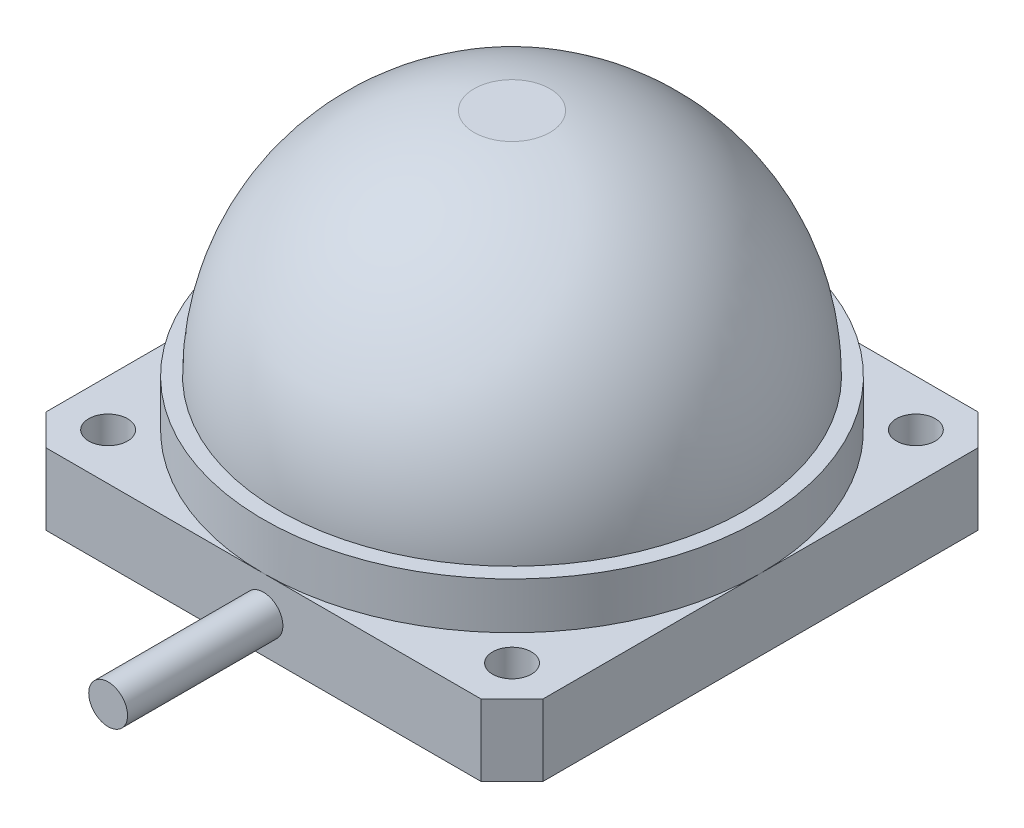
ISO-10303-21;
HEADER;
FILE_DESCRIPTION(('STEP AP214'),'2;1');
FILE_NAME('part.step','',(''),(''),'','','');
FILE_SCHEMA(('AUTOMOTIVE_DESIGN { 1 0 10303 214 1 1 1 1 }'));
ENDSEC;
DATA;
#1=APPLICATION_CONTEXT('core data for automotive mechanical design processes');
#2=APPLICATION_PROTOCOL_DEFINITION('international standard','automotive_design',2000,#1);
#3=PRODUCT_CONTEXT('',#1,'mechanical');
#4=PRODUCT('Part','Part','',(#3));
#5=PRODUCT_RELATED_PRODUCT_CATEGORY('part','',(#4));
#6=PRODUCT_DEFINITION_FORMATION('','',#4);
#7=PRODUCT_DEFINITION_CONTEXT('part definition',#1,'design');
#8=PRODUCT_DEFINITION('design','',#6,#7);
#9=PRODUCT_DEFINITION_SHAPE('','',#8);
#10=(LENGTH_UNIT() NAMED_UNIT(*) SI_UNIT(.MILLI.,.METRE.));
#11=(NAMED_UNIT(*) PLANE_ANGLE_UNIT() SI_UNIT($,.RADIAN.));
#12=(NAMED_UNIT(*) SI_UNIT($,.STERADIAN.) SOLID_ANGLE_UNIT());
#13=UNCERTAINTY_MEASURE_WITH_UNIT(LENGTH_MEASURE(1.E-05),#10,'distance_accuracy_value','');
#14=(GEOMETRIC_REPRESENTATION_CONTEXT(3) GLOBAL_UNCERTAINTY_ASSIGNED_CONTEXT((#13)) GLOBAL_UNIT_ASSIGNED_CONTEXT((#10,
#11,#12)) REPRESENTATION_CONTEXT('',''));
#15=CARTESIAN_POINT('',(0.,0.,0.));
#16=DIRECTION('',(0.,0.,1.));
#17=DIRECTION('',(1.,0.,0.));
#18=AXIS2_PLACEMENT_3D('',#15,#16,#17);
#19=CARTESIAN_POINT('',(0.,0.,0.));
#20=DIRECTION('',(0.,1.,0.));
#21=DIRECTION('',(1.,0.,0.));
#22=AXIS2_PLACEMENT_3D('',#19,#20,#21);
#23=SPHERICAL_SURFACE('',#22,15.);
#24=CARTESIAN_POINT('',(0.,0.,0.));
#25=DIRECTION('',(0.,-1.,0.));
#26=DIRECTION('',(1.,0.,0.));
#27=AXIS2_PLACEMENT_3D('',#24,#25,#26);
#28=CIRCLE('',#27,15.);
#29=CARTESIAN_POINT('',(15.,0.,0.));
#30=VERTEX_POINT('',#29);
#31=EDGE_CURVE('E148',#30,#30,#28,.T.);
#32=ORIENTED_EDGE('',*,*,#31,.F.);
#33=EDGE_LOOP('',(#32));
#34=FACE_BOUND('',#33,.T.);
#35=CARTESIAN_POINT('',(0.,14.8,0.));
#36=DIRECTION('',(0.,1.,0.));
#37=DIRECTION('',(0.,0.,1.));
#38=AXIS2_PLACEMENT_3D('',#35,#36,#37);
#39=CIRCLE('',#38,2.44131112314675);
#40=CARTESIAN_POINT('',(0.,14.8,2.44131112314675));
#41=VERTEX_POINT('',#40);
#42=EDGE_CURVE('E46',#41,#41,#39,.T.);
#43=ORIENTED_EDGE('',*,*,#42,.F.);
#44=EDGE_LOOP('',(#43));
#45=FACE_BOUND('',#44,.T.);
#46=ADVANCED_FACE('F41',(#34,#45),#23,.T.);
#47=CARTESIAN_POINT('',(0.,-3.,0.));
#48=DIRECTION('',(0.,1.,0.));
#49=DIRECTION('',(-1.,0.,0.));
#50=AXIS2_PLACEMENT_3D('',#47,#48,#49);
#51=CYLINDRICAL_SURFACE('',#50,16.);
#52=CARTESIAN_POINT('',(0.,-3.,0.));
#53=DIRECTION('',(0.,-1.,0.));
#54=DIRECTION('',(1.,0.,0.));
#55=AXIS2_PLACEMENT_3D('',#52,#53,#54);
#56=CIRCLE('',#55,16.);
#57=CARTESIAN_POINT('',(16.,-3.,0.));
#58=VERTEX_POINT('',#57);
#59=CARTESIAN_POINT('',(0.,-3.,16.));
#60=VERTEX_POINT('',#59);
#61=EDGE_CURVE('E138',#58,#60,#56,.T.);
#62=ORIENTED_EDGE('',*,*,#61,.F.);
#63=CARTESIAN_POINT('',(0.,-3.,-16.));
#64=VERTEX_POINT('',#63);
#65=EDGE_CURVE('E142',#64,#58,#56,.T.);
#66=ORIENTED_EDGE('',*,*,#65,.F.);
#67=CARTESIAN_POINT('',(-16.,-3.,0.));
#68=VERTEX_POINT('',#67);
#69=EDGE_CURVE('E154',#68,#64,#56,.T.);
#70=ORIENTED_EDGE('',*,*,#69,.F.);
#71=EDGE_CURVE('E145',#60,#68,#56,.T.);
#72=ORIENTED_EDGE('',*,*,#71,.F.);
#73=EDGE_LOOP('',(#62,#66,#70,#72));
#74=FACE_BOUND('',#73,.T.);
#75=CARTESIAN_POINT('',(0.,0.,0.));
#76=DIRECTION('',(0.,-1.,0.));
#77=DIRECTION('',(1.,0.,0.));
#78=AXIS2_PLACEMENT_3D('',#75,#76,#77);
#79=CIRCLE('',#78,16.);
#80=CARTESIAN_POINT('',(16.,0.,0.));
#81=VERTEX_POINT('',#80);
#82=EDGE_CURVE('E155',#81,#81,#79,.T.);
#83=ORIENTED_EDGE('',*,*,#82,.T.);
#84=EDGE_LOOP('',(#83));
#85=FACE_BOUND('',#84,.T.);
#86=ADVANCED_FACE('F139',(#74,#85),#51,.T.);
#87=CARTESIAN_POINT('',(0.,0.,0.));
#88=DIRECTION('',(0.,-1.,0.));
#89=DIRECTION('',(1.,0.,0.));
#90=AXIS2_PLACEMENT_3D('',#87,#88,#89);
#91=PLANE('',#90);
#92=ORIENTED_EDGE('',*,*,#31,.T.);
#93=EDGE_LOOP('',(#92));
#94=FACE_BOUND('',#93,.T.);
#95=ORIENTED_EDGE('',*,*,#82,.F.);
#96=EDGE_LOOP('',(#95));
#97=FACE_BOUND('',#96,.T.);
#98=ADVANCED_FACE('F283',(#94,#97),#91,.F.);
#99=CARTESIAN_POINT('',(0.,-3.,0.));
#100=DIRECTION('',(0.,1.,0.));
#101=DIRECTION('',(-1.,0.,0.));
#102=AXIS2_PLACEMENT_3D('',#99,#100,#101);
#103=PLANE('',#102);
#104=CARTESIAN_POINT('',(13.,-3.,13.));
#105=DIRECTION('',(0.,1.,0.));
#106=DIRECTION('',(0.,0.,1.));
#107=AXIS2_PLACEMENT_3D('',#104,#105,#106);
#108=CIRCLE('',#107,1.25);
#109=CARTESIAN_POINT('',(13.,-3.,14.25));
#110=VERTEX_POINT('',#109);
#111=EDGE_CURVE('E257',#110,#110,#108,.T.);
#112=ORIENTED_EDGE('',*,*,#111,.F.);
#113=EDGE_LOOP('',(#112));
#114=FACE_BOUND('',#113,.T.);
#115=DIRECTION('',(-1.,0.,0.));
#116=VECTOR('',#115,1.);
#117=CARTESIAN_POINT('',(-16.,-3.,16.));
#118=LINE('',#117,#116);
#119=CARTESIAN_POINT('',(14.,-3.,16.));
#120=VERTEX_POINT('',#119);
#121=EDGE_CURVE('E165',#120,#60,#118,.T.);
#122=ORIENTED_EDGE('',*,*,#121,.F.);
#123=DIRECTION('',(-0.707106781186546,0.,0.707106781186549));
#124=VECTOR('',#123,1.);
#125=CARTESIAN_POINT('',(15.,-3.,15.));
#126=LINE('',#125,#124);
#127=CARTESIAN_POINT('',(16.,-3.,14.));
#128=VERTEX_POINT('',#127);
#129=EDGE_CURVE('E51',#120,#128,#126,.F.);
#130=ORIENTED_EDGE('',*,*,#129,.T.);
#131=DIRECTION('',(0.,0.,1.));
#132=VECTOR('',#131,1.);
#133=CARTESIAN_POINT('',(16.,-3.,-16.));
#134=LINE('',#133,#132);
#135=EDGE_CURVE('E127',#58,#128,#134,.T.);
#136=ORIENTED_EDGE('',*,*,#135,.F.);
#137=ORIENTED_EDGE('',*,*,#61,.T.);
#138=EDGE_LOOP('',(#122,#130,#136,#137));
#139=FACE_BOUND('',#138,.T.);
#140=ADVANCED_FACE('F156',(#114,#139),#103,.T.);
#141=CARTESIAN_POINT('',(-13.,-3.,13.));
#142=DIRECTION('',(0.,1.,0.));
#143=DIRECTION('',(0.,0.,1.));
#144=AXIS2_PLACEMENT_3D('',#141,#142,#143);
#145=CIRCLE('',#144,1.25);
#146=CARTESIAN_POINT('',(-13.,-3.,14.25));
#147=VERTEX_POINT('',#146);
#148=EDGE_CURVE('E159',#147,#147,#145,.T.);
#149=ORIENTED_EDGE('',*,*,#148,.F.);
#150=EDGE_LOOP('',(#149));
#151=FACE_BOUND('',#150,.T.);
#152=DIRECTION('',(0.,0.,-1.));
#153=VECTOR('',#152,1.);
#154=CARTESIAN_POINT('',(-16.,-3.,-16.));
#155=LINE('',#154,#153);
#156=CARTESIAN_POINT('',(-16.,-3.,14.));
#157=VERTEX_POINT('',#156);
#158=EDGE_CURVE('E168',#157,#68,#155,.T.);
#159=ORIENTED_EDGE('',*,*,#158,.F.);
#160=DIRECTION('',(-0.707106781186549,0.,-0.707106781186546));
#161=VECTOR('',#160,1.);
#162=CARTESIAN_POINT('',(-15.,-3.,15.));
#163=LINE('',#162,#161);
#164=CARTESIAN_POINT('',(-14.,-3.,16.));
#165=VERTEX_POINT('',#164);
#166=EDGE_CURVE('E65',#157,#165,#163,.F.);
#167=ORIENTED_EDGE('',*,*,#166,.T.);
#168=EDGE_CURVE('E132',#60,#165,#118,.T.);
#169=ORIENTED_EDGE('',*,*,#168,.F.);
#170=ORIENTED_EDGE('',*,*,#71,.T.);
#171=EDGE_LOOP('',(#159,#167,#169,#170));
#172=FACE_BOUND('',#171,.T.);
#173=ADVANCED_FACE('F228',(#151,#172),#103,.T.);
#174=CARTESIAN_POINT('',(-13.,-3.,-13.));
#175=DIRECTION('',(0.,1.,0.));
#176=DIRECTION('',(0.,0.,1.));
#177=AXIS2_PLACEMENT_3D('',#174,#175,#176);
#178=CIRCLE('',#177,1.25);
#179=CARTESIAN_POINT('',(-13.,-3.,-11.75));
#180=VERTEX_POINT('',#179);
#181=EDGE_CURVE('E263',#180,#180,#178,.T.);
#182=ORIENTED_EDGE('',*,*,#181,.F.);
#183=EDGE_LOOP('',(#182));
#184=FACE_BOUND('',#183,.T.);
#185=DIRECTION('',(1.,0.,0.));
#186=VECTOR('',#185,1.);
#187=CARTESIAN_POINT('',(-16.,-3.,-16.));
#188=LINE('',#187,#186);
#189=CARTESIAN_POINT('',(-14.,-3.,-16.));
#190=VERTEX_POINT('',#189);
#191=EDGE_CURVE('E170',#190,#64,#188,.T.);
#192=ORIENTED_EDGE('',*,*,#191,.F.);
#193=DIRECTION('',(0.707106781186546,0.,-0.707106781186549));
#194=VECTOR('',#193,1.);
#195=CARTESIAN_POINT('',(-15.,-3.,-15.));
#196=LINE('',#195,#194);
#197=CARTESIAN_POINT('',(-16.,-3.,-14.));
#198=VERTEX_POINT('',#197);
#199=EDGE_CURVE('E182',#190,#198,#196,.F.);
#200=ORIENTED_EDGE('',*,*,#199,.T.);
#201=EDGE_CURVE('E167',#68,#198,#155,.T.);
#202=ORIENTED_EDGE('',*,*,#201,.F.);
#203=ORIENTED_EDGE('',*,*,#69,.T.);
#204=EDGE_LOOP('',(#192,#200,#202,#203));
#205=FACE_BOUND('',#204,.T.);
#206=ADVANCED_FACE('F232',(#184,#205),#103,.T.);
#207=CARTESIAN_POINT('',(16.,-7.6,-16.));
#208=DIRECTION('',(-1.,0.,0.));
#209=DIRECTION('',(0.,-1.,0.));
#210=AXIS2_PLACEMENT_3D('',#207,#208,#209);
#211=PLANE('',#210);
#212=DIRECTION('',(0.,0.,1.));
#213=VECTOR('',#212,1.);
#214=CARTESIAN_POINT('',(16.,-7.6,-16.));
#215=LINE('',#214,#213);
#216=CARTESIAN_POINT('',(16.,-7.6,-14.));
#217=VERTEX_POINT('',#216);
#218=CARTESIAN_POINT('',(16.,-7.6,14.));
#219=VERTEX_POINT('',#218);
#220=EDGE_CURVE('E171',#217,#219,#215,.T.);
#221=ORIENTED_EDGE('',*,*,#220,.F.);
#222=DIRECTION('',(0.,1.,0.));
#223=VECTOR('',#222,1.);
#224=CARTESIAN_POINT('',(16.,-7.6,-14.));
#225=LINE('',#224,#223);
#226=CARTESIAN_POINT('',(16.,-3.,-14.));
#227=VERTEX_POINT('',#226);
#228=EDGE_CURVE('E129',#217,#227,#225,.T.);
#229=ORIENTED_EDGE('',*,*,#228,.T.);
#230=EDGE_CURVE('E122',#227,#58,#134,.T.);
#231=ORIENTED_EDGE('',*,*,#230,.T.);
#232=ORIENTED_EDGE('',*,*,#135,.T.);
#233=DIRECTION('',(0.,-1.,0.));
#234=VECTOR('',#233,1.);
#235=CARTESIAN_POINT('',(16.,-7.6,14.));
#236=LINE('',#235,#234);
#237=EDGE_CURVE('E197',#128,#219,#236,.T.);
#238=ORIENTED_EDGE('',*,*,#237,.T.);
#239=EDGE_LOOP('',(#221,#229,#231,#232,#238));
#240=FACE_BOUND('',#239,.T.);
#241=ADVANCED_FACE('F125',(#240),#211,.F.);
#242=CARTESIAN_POINT('',(-16.,-7.6,16.));
#243=DIRECTION('',(0.,0.,-1.));
#244=DIRECTION('',(-1.,0.,0.));
#245=AXIS2_PLACEMENT_3D('',#242,#243,#244);
#246=PLANE('',#245);
#247=CARTESIAN_POINT('',(0.,-5.3,16.));
#248=DIRECTION('',(0.,0.,-1.));
#249=DIRECTION('',(-1.,0.,0.));
#250=AXIS2_PLACEMENT_3D('',#247,#248,#249);
#251=CIRCLE('',#250,1.25);
#252=CARTESIAN_POINT('',(-1.25,-5.3,16.));
#253=VERTEX_POINT('',#252);
#254=EDGE_CURVE('E11',#253,#253,#251,.F.);
#255=ORIENTED_EDGE('',*,*,#254,.F.);
#256=EDGE_LOOP('',(#255));
#257=FACE_BOUND('',#256,.T.);
#258=ORIENTED_EDGE('',*,*,#168,.T.);
#259=DIRECTION('',(0.,-1.,0.));
#260=VECTOR('',#259,1.);
#261=CARTESIAN_POINT('',(-14.,-7.6,16.));
#262=LINE('',#261,#260);
#263=CARTESIAN_POINT('',(-14.,-7.6,16.));
#264=VERTEX_POINT('',#263);
#265=EDGE_CURVE('E205',#165,#264,#262,.T.);
#266=ORIENTED_EDGE('',*,*,#265,.T.);
#267=DIRECTION('',(-1.,0.,0.));
#268=VECTOR('',#267,1.);
#269=CARTESIAN_POINT('',(-16.,-7.6,16.));
#270=LINE('',#269,#268);
#271=CARTESIAN_POINT('',(14.,-7.6,16.));
#272=VERTEX_POINT('',#271);
#273=EDGE_CURVE('E212',#272,#264,#270,.T.);
#274=ORIENTED_EDGE('',*,*,#273,.F.);
#275=DIRECTION('',(0.,1.,0.));
#276=VECTOR('',#275,1.);
#277=CARTESIAN_POINT('',(14.,-7.6,16.));
#278=LINE('',#277,#276);
#279=EDGE_CURVE('E203',#272,#120,#278,.T.);
#280=ORIENTED_EDGE('',*,*,#279,.T.);
#281=ORIENTED_EDGE('',*,*,#121,.T.);
#282=EDGE_LOOP('',(#258,#266,#274,#280,#281));
#283=FACE_BOUND('',#282,.T.);
#284=ADVANCED_FACE('F211',(#257,#283),#246,.F.);
#285=CARTESIAN_POINT('',(-16.,-7.6,-16.));
#286=DIRECTION('',(1.,0.,0.));
#287=DIRECTION('',(0.,1.,0.));
#288=AXIS2_PLACEMENT_3D('',#285,#286,#287);
#289=PLANE('',#288);
#290=ORIENTED_EDGE('',*,*,#201,.T.);
#291=DIRECTION('',(0.,-1.,0.));
#292=VECTOR('',#291,1.);
#293=CARTESIAN_POINT('',(-16.,-7.6,-14.));
#294=LINE('',#293,#292);
#295=CARTESIAN_POINT('',(-16.,-7.6,-14.));
#296=VERTEX_POINT('',#295);
#297=EDGE_CURVE('E187',#198,#296,#294,.T.);
#298=ORIENTED_EDGE('',*,*,#297,.T.);
#299=DIRECTION('',(0.,0.,-1.));
#300=VECTOR('',#299,1.);
#301=CARTESIAN_POINT('',(-16.,-7.6,-16.));
#302=LINE('',#301,#300);
#303=CARTESIAN_POINT('',(-16.,-7.6,14.));
#304=VERTEX_POINT('',#303);
#305=EDGE_CURVE('E221',#304,#296,#302,.T.);
#306=ORIENTED_EDGE('',*,*,#305,.F.);
#307=DIRECTION('',(0.,1.,0.));
#308=VECTOR('',#307,1.);
#309=CARTESIAN_POINT('',(-16.,-7.6,14.));
#310=LINE('',#309,#308);
#311=EDGE_CURVE('E184',#304,#157,#310,.T.);
#312=ORIENTED_EDGE('',*,*,#311,.T.);
#313=ORIENTED_EDGE('',*,*,#158,.T.);
#314=EDGE_LOOP('',(#290,#298,#306,#312,#313));
#315=FACE_BOUND('',#314,.T.);
#316=ADVANCED_FACE('F227',(#315),#289,.F.);
#317=CARTESIAN_POINT('',(-16.,-7.6,-16.));
#318=DIRECTION('',(0.,0.,1.));
#319=DIRECTION('',(1.,0.,0.));
#320=AXIS2_PLACEMENT_3D('',#317,#318,#319);
#321=PLANE('',#320);
#322=DIRECTION('',(1.,0.,0.));
#323=VECTOR('',#322,1.);
#324=CARTESIAN_POINT('',(-16.,-7.6,-16.));
#325=LINE('',#324,#323);
#326=CARTESIAN_POINT('',(-14.,-7.6,-16.));
#327=VERTEX_POINT('',#326);
#328=CARTESIAN_POINT('',(14.,-7.6,-16.));
#329=VERTEX_POINT('',#328);
#330=EDGE_CURVE('E163',#327,#329,#325,.T.);
#331=ORIENTED_EDGE('',*,*,#330,.F.);
#332=DIRECTION('',(0.,1.,0.));
#333=VECTOR('',#332,1.);
#334=CARTESIAN_POINT('',(-14.,-7.6,-16.));
#335=LINE('',#334,#333);
#336=EDGE_CURVE('E179',#327,#190,#335,.T.);
#337=ORIENTED_EDGE('',*,*,#336,.T.);
#338=ORIENTED_EDGE('',*,*,#191,.T.);
#339=CARTESIAN_POINT('',(14.,-3.,-16.));
#340=VERTEX_POINT('',#339);
#341=EDGE_CURVE('E153',#64,#340,#188,.T.);
#342=ORIENTED_EDGE('',*,*,#341,.T.);
#343=DIRECTION('',(0.,-1.,0.));
#344=VECTOR('',#343,1.);
#345=CARTESIAN_POINT('',(14.,-7.6,-16.));
#346=LINE('',#345,#344);
#347=EDGE_CURVE('E177',#340,#329,#346,.T.);
#348=ORIENTED_EDGE('',*,*,#347,.T.);
#349=EDGE_LOOP('',(#331,#337,#338,#342,#348));
#350=FACE_BOUND('',#349,.T.);
#351=ADVANCED_FACE('F242',(#350),#321,.F.);
#352=CARTESIAN_POINT('',(0.,-7.6,0.));
#353=DIRECTION('',(0.,1.,0.));
#354=DIRECTION('',(-1.,0.,0.));
#355=AXIS2_PLACEMENT_3D('',#352,#353,#354);
#356=PLANE('',#355);
#357=CARTESIAN_POINT('',(-13.,-7.6,-13.));
#358=DIRECTION('',(0.,1.,0.));
#359=DIRECTION('',(-1.,0.,0.));
#360=AXIS2_PLACEMENT_3D('',#357,#358,#359);
#361=CIRCLE('',#360,1.25);
#362=CARTESIAN_POINT('',(-14.25,-7.6,-13.));
#363=VERTEX_POINT('',#362);
#364=EDGE_CURVE('E260',#363,#363,#361,.T.);
#365=ORIENTED_EDGE('',*,*,#364,.T.);
#366=EDGE_LOOP('',(#365));
#367=FACE_BOUND('',#366,.T.);
#368=CARTESIAN_POINT('',(13.,-7.6,13.));
#369=DIRECTION('',(0.,1.,0.));
#370=DIRECTION('',(-1.,0.,0.));
#371=AXIS2_PLACEMENT_3D('',#368,#369,#370);
#372=CIRCLE('',#371,1.25);
#373=CARTESIAN_POINT('',(11.75,-7.6,13.));
#374=VERTEX_POINT('',#373);
#375=EDGE_CURVE('E254',#374,#374,#372,.T.);
#376=ORIENTED_EDGE('',*,*,#375,.T.);
#377=EDGE_LOOP('',(#376));
#378=FACE_BOUND('',#377,.T.);
#379=CARTESIAN_POINT('',(13.,-7.6,-13.));
#380=DIRECTION('',(0.,1.,0.));
#381=DIRECTION('',(-1.,0.,0.));
#382=AXIS2_PLACEMENT_3D('',#379,#380,#381);
#383=CIRCLE('',#382,1.25);
#384=CARTESIAN_POINT('',(11.75,-7.6,-13.));
#385=VERTEX_POINT('',#384);
#386=EDGE_CURVE('E248',#385,#385,#383,.T.);
#387=ORIENTED_EDGE('',*,*,#386,.T.);
#388=EDGE_LOOP('',(#387));
#389=FACE_BOUND('',#388,.T.);
#390=CARTESIAN_POINT('',(-13.,-7.6,13.));
#391=DIRECTION('',(0.,1.,0.));
#392=DIRECTION('',(-1.,0.,0.));
#393=AXIS2_PLACEMENT_3D('',#390,#391,#392);
#394=CIRCLE('',#393,1.25);
#395=CARTESIAN_POINT('',(-14.25,-7.6,13.));
#396=VERTEX_POINT('',#395);
#397=EDGE_CURVE('E157',#396,#396,#394,.T.);
#398=ORIENTED_EDGE('',*,*,#397,.T.);
#399=EDGE_LOOP('',(#398));
#400=FACE_BOUND('',#399,.T.);
#401=ORIENTED_EDGE('',*,*,#305,.T.);
#402=DIRECTION('',(-0.707106781186546,0.,0.707106781186549));
#403=VECTOR('',#402,1.);
#404=CARTESIAN_POINT('',(-14.,-7.6,-16.));
#405=LINE('',#404,#403);
#406=EDGE_CURVE('E195',#296,#327,#405,.F.);
#407=ORIENTED_EDGE('',*,*,#406,.T.);
#408=ORIENTED_EDGE('',*,*,#330,.T.);
#409=DIRECTION('',(-0.707106781186549,0.,-0.707106781186546));
#410=VECTOR('',#409,1.);
#411=CARTESIAN_POINT('',(16.,-7.6,-14.));
#412=LINE('',#411,#410);
#413=EDGE_CURVE('E193',#329,#217,#412,.F.);
#414=ORIENTED_EDGE('',*,*,#413,.T.);
#415=ORIENTED_EDGE('',*,*,#220,.T.);
#416=DIRECTION('',(0.707106781186546,0.,-0.707106781186549));
#417=VECTOR('',#416,1.);
#418=CARTESIAN_POINT('',(14.,-7.6,16.));
#419=LINE('',#418,#417);
#420=EDGE_CURVE('E189',#219,#272,#419,.F.);
#421=ORIENTED_EDGE('',*,*,#420,.T.);
#422=ORIENTED_EDGE('',*,*,#273,.T.);
#423=DIRECTION('',(0.707106781186549,0.,0.707106781186546));
#424=VECTOR('',#423,1.);
#425=CARTESIAN_POINT('',(-16.,-7.6,14.));
#426=LINE('',#425,#424);
#427=EDGE_CURVE('E191',#264,#304,#426,.F.);
#428=ORIENTED_EDGE('',*,*,#427,.T.);
#429=EDGE_LOOP('',(#401,#407,#408,#414,#415,#421,#422,#428));
#430=FACE_BOUND('',#429,.T.);
#431=ADVANCED_FACE('F217',(#367,#378,#389,#400,#430),#356,.F.);
#432=CARTESIAN_POINT('',(13.,-3.,-13.));
#433=DIRECTION('',(0.,1.,0.));
#434=DIRECTION('',(0.,0.,1.));
#435=AXIS2_PLACEMENT_3D('',#432,#433,#434);
#436=CIRCLE('',#435,1.25);
#437=CARTESIAN_POINT('',(13.,-3.,-11.75));
#438=VERTEX_POINT('',#437);
#439=EDGE_CURVE('E251',#438,#438,#436,.T.);
#440=ORIENTED_EDGE('',*,*,#439,.F.);
#441=EDGE_LOOP('',(#440));
#442=FACE_BOUND('',#441,.T.);
#443=ORIENTED_EDGE('',*,*,#230,.F.);
#444=DIRECTION('',(0.707106781186549,0.,0.707106781186546));
#445=VECTOR('',#444,1.);
#446=CARTESIAN_POINT('',(15.,-3.,-15.));
#447=LINE('',#446,#445);
#448=EDGE_CURVE('E200',#227,#340,#447,.F.);
#449=ORIENTED_EDGE('',*,*,#448,.T.);
#450=ORIENTED_EDGE('',*,*,#341,.F.);
#451=ORIENTED_EDGE('',*,*,#65,.T.);
#452=EDGE_LOOP('',(#443,#449,#450,#451));
#453=FACE_BOUND('',#452,.T.);
#454=ADVANCED_FACE('F151',(#442,#453),#103,.T.);
#455=CARTESIAN_POINT('',(-13.,-3.,13.));
#456=DIRECTION('',(0.,1.,0.));
#457=DIRECTION('',(0.,0.,1.));
#458=AXIS2_PLACEMENT_3D('',#455,#456,#457);
#459=CYLINDRICAL_SURFACE('',#458,1.25);
#460=ORIENTED_EDGE('',*,*,#397,.F.);
#461=EDGE_LOOP('',(#460));
#462=FACE_BOUND('',#461,.T.);
#463=ORIENTED_EDGE('',*,*,#148,.T.);
#464=EDGE_LOOP('',(#463));
#465=FACE_BOUND('',#464,.T.);
#466=ADVANCED_FACE('F331',(#462,#465),#459,.F.);
#467=CARTESIAN_POINT('',(13.,-3.,-13.));
#468=DIRECTION('',(0.,1.,0.));
#469=DIRECTION('',(0.,0.,1.));
#470=AXIS2_PLACEMENT_3D('',#467,#468,#469);
#471=CYLINDRICAL_SURFACE('',#470,1.25);
#472=ORIENTED_EDGE('',*,*,#386,.F.);
#473=EDGE_LOOP('',(#472));
#474=FACE_BOUND('',#473,.T.);
#475=ORIENTED_EDGE('',*,*,#439,.T.);
#476=EDGE_LOOP('',(#475));
#477=FACE_BOUND('',#476,.T.);
#478=ADVANCED_FACE('F327',(#474,#477),#471,.F.);
#479=CARTESIAN_POINT('',(13.,-3.,13.));
#480=DIRECTION('',(0.,1.,0.));
#481=DIRECTION('',(0.,0.,1.));
#482=AXIS2_PLACEMENT_3D('',#479,#480,#481);
#483=CYLINDRICAL_SURFACE('',#482,1.25);
#484=ORIENTED_EDGE('',*,*,#375,.F.);
#485=EDGE_LOOP('',(#484));
#486=FACE_BOUND('',#485,.T.);
#487=ORIENTED_EDGE('',*,*,#111,.T.);
#488=EDGE_LOOP('',(#487));
#489=FACE_BOUND('',#488,.T.);
#490=ADVANCED_FACE('F323',(#486,#489),#483,.F.);
#491=CARTESIAN_POINT('',(-13.,-3.,-13.));
#492=DIRECTION('',(0.,1.,0.));
#493=DIRECTION('',(0.,0.,1.));
#494=AXIS2_PLACEMENT_3D('',#491,#492,#493);
#495=CYLINDRICAL_SURFACE('',#494,1.25);
#496=ORIENTED_EDGE('',*,*,#364,.F.);
#497=EDGE_LOOP('',(#496));
#498=FACE_BOUND('',#497,.T.);
#499=ORIENTED_EDGE('',*,*,#181,.T.);
#500=EDGE_LOOP('',(#499));
#501=FACE_BOUND('',#500,.T.);
#502=ADVANCED_FACE('F295',(#498,#501),#495,.F.);
#503=CARTESIAN_POINT('',(-14.,-7.6,-16.));
#504=DIRECTION('',(0.707106781186549,0.,0.707106781186546));
#505=DIRECTION('',(0.,1.,0.));
#506=AXIS2_PLACEMENT_3D('',#503,#504,#505);
#507=PLANE('',#506);
#508=ORIENTED_EDGE('',*,*,#406,.F.);
#509=ORIENTED_EDGE('',*,*,#297,.F.);
#510=ORIENTED_EDGE('',*,*,#199,.F.);
#511=ORIENTED_EDGE('',*,*,#336,.F.);
#512=EDGE_LOOP('',(#508,#509,#510,#511));
#513=FACE_BOUND('',#512,.T.);
#514=ADVANCED_FACE('F236',(#513),#507,.F.);
#515=CARTESIAN_POINT('',(16.,-7.6,-14.));
#516=DIRECTION('',(-0.707106781186546,0.,0.707106781186549));
#517=DIRECTION('',(0.,1.,0.));
#518=AXIS2_PLACEMENT_3D('',#515,#516,#517);
#519=PLANE('',#518);
#520=ORIENTED_EDGE('',*,*,#413,.F.);
#521=ORIENTED_EDGE('',*,*,#347,.F.);
#522=ORIENTED_EDGE('',*,*,#448,.F.);
#523=ORIENTED_EDGE('',*,*,#228,.F.);
#524=EDGE_LOOP('',(#520,#521,#522,#523));
#525=FACE_BOUND('',#524,.T.);
#526=ADVANCED_FACE('F294',(#525),#519,.F.);
#527=CARTESIAN_POINT('',(-16.,-7.6,14.));
#528=DIRECTION('',(0.707106781186546,0.,-0.707106781186549));
#529=DIRECTION('',(0.,1.,0.));
#530=AXIS2_PLACEMENT_3D('',#527,#528,#529);
#531=PLANE('',#530);
#532=ORIENTED_EDGE('',*,*,#427,.F.);
#533=ORIENTED_EDGE('',*,*,#265,.F.);
#534=ORIENTED_EDGE('',*,*,#166,.F.);
#535=ORIENTED_EDGE('',*,*,#311,.F.);
#536=EDGE_LOOP('',(#532,#533,#534,#535));
#537=FACE_BOUND('',#536,.T.);
#538=ADVANCED_FACE('F224',(#537),#531,.F.);
#539=CARTESIAN_POINT('',(14.,-7.6,16.));
#540=DIRECTION('',(-0.707106781186549,0.,-0.707106781186546));
#541=DIRECTION('',(0.,1.,0.));
#542=AXIS2_PLACEMENT_3D('',#539,#540,#541);
#543=PLANE('',#542);
#544=ORIENTED_EDGE('',*,*,#420,.F.);
#545=ORIENTED_EDGE('',*,*,#237,.F.);
#546=ORIENTED_EDGE('',*,*,#129,.F.);
#547=ORIENTED_EDGE('',*,*,#279,.F.);
#548=EDGE_LOOP('',(#544,#545,#546,#547));
#549=FACE_BOUND('',#548,.T.);
#550=ADVANCED_FACE('F44',(#549),#543,.F.);
#551=CARTESIAN_POINT('',(0.,-5.3,26.));
#552=DIRECTION('',(0.,0.,-1.));
#553=DIRECTION('',(-1.,0.,0.));
#554=AXIS2_PLACEMENT_3D('',#551,#552,#553);
#555=CYLINDRICAL_SURFACE('',#554,1.25);
#556=CARTESIAN_POINT('',(0.,-5.3,26.));
#557=DIRECTION('',(0.,0.,1.));
#558=DIRECTION('',(1.,0.,0.));
#559=AXIS2_PLACEMENT_3D('',#556,#557,#558);
#560=CIRCLE('',#559,1.25);
#561=CARTESIAN_POINT('',(1.25,-5.3,26.));
#562=VERTEX_POINT('',#561);
#563=EDGE_CURVE('E266',#562,#562,#560,.T.);
#564=ORIENTED_EDGE('',*,*,#563,.F.);
#565=EDGE_LOOP('',(#564));
#566=FACE_BOUND('',#565,.T.);
#567=ORIENTED_EDGE('',*,*,#254,.T.);
#568=EDGE_LOOP('',(#567));
#569=FACE_BOUND('',#568,.T.);
#570=ADVANCED_FACE('F307',(#566,#569),#555,.T.);
#571=CARTESIAN_POINT('',(0.,-5.3,26.));
#572=DIRECTION('',(0.,0.,1.));
#573=DIRECTION('',(1.,0.,0.));
#574=AXIS2_PLACEMENT_3D('',#571,#572,#573);
#575=PLANE('',#574);
#576=ORIENTED_EDGE('',*,*,#563,.T.);
#577=EDGE_LOOP('',(#576));
#578=FACE_BOUND('',#577,.T.);
#579=ADVANCED_FACE('F311',(#578),#575,.T.);
#580=CARTESIAN_POINT('',(0.,14.8,0.));
#581=DIRECTION('',(0.,1.,0.));
#582=DIRECTION('',(0.,0.,1.));
#583=AXIS2_PLACEMENT_3D('',#580,#581,#582);
#584=PLANE('',#583);
#585=ORIENTED_EDGE('',*,*,#42,.T.);
#586=EDGE_LOOP('',(#585));
#587=FACE_BOUND('',#586,.T.);
#588=ADVANCED_FACE('F273',(#587),#584,.T.);
#589=CLOSED_SHELL('',(#46,#86,#98,#140,#173,#206,#241,#284,#316,#351,#431,#454,#466,#478,#490,
#502,#514,#526,#538,#550,#570,#579,#588));
#590=MANIFOLD_SOLID_BREP('B2',#589);
#591=ADVANCED_BREP_SHAPE_REPRESENTATION('',(#18,#590),#14);
#592=SHAPE_DEFINITION_REPRESENTATION(#9,#591);
ENDSEC;
END-ISO-10303-21;
